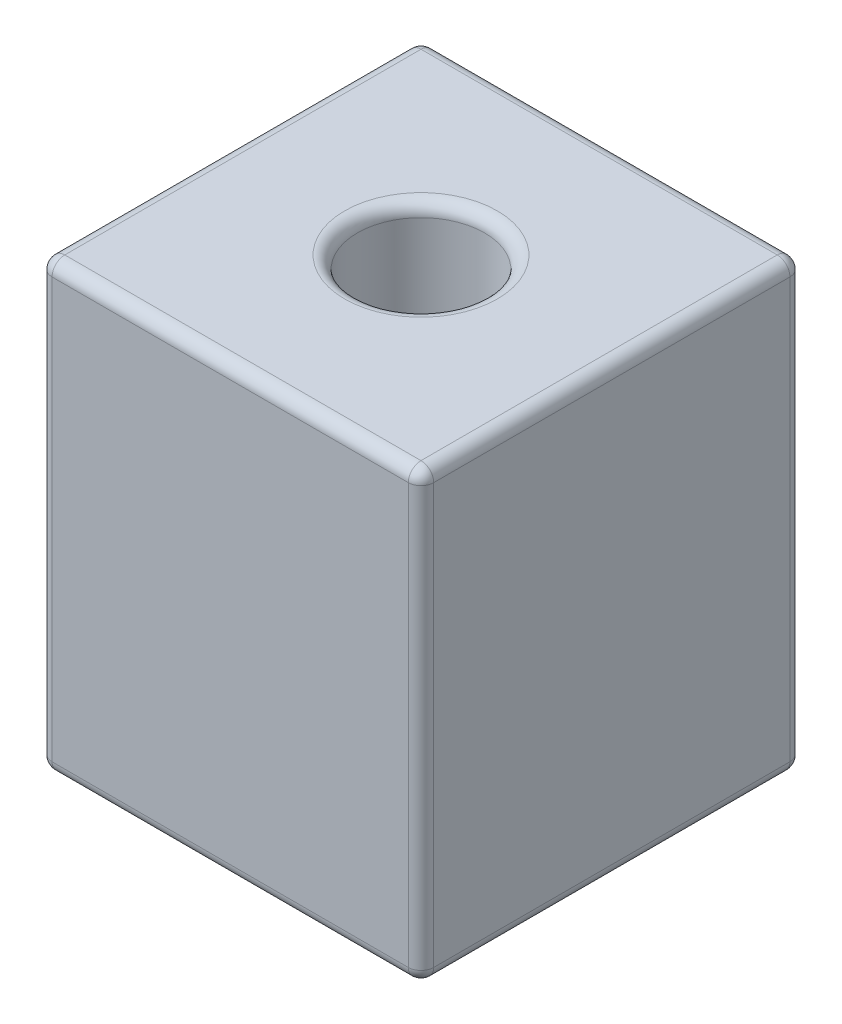
ISO-10303-21;
HEADER;
FILE_DESCRIPTION(('STEP AP214'),'2;1');
FILE_NAME('part.step','',(''),(''),'','','');
FILE_SCHEMA(('AUTOMOTIVE_DESIGN { 1 0 10303 214 1 1 1 1 }'));
ENDSEC;
DATA;
#1=APPLICATION_CONTEXT('core data for automotive mechanical design processes');
#2=APPLICATION_PROTOCOL_DEFINITION('international standard','automotive_design',2000,#1);
#3=PRODUCT_CONTEXT('',#1,'mechanical');
#4=PRODUCT('Part','Part','',(#3));
#5=PRODUCT_RELATED_PRODUCT_CATEGORY('part','',(#4));
#6=PRODUCT_DEFINITION_FORMATION('','',#4);
#7=PRODUCT_DEFINITION_CONTEXT('part definition',#1,'design');
#8=PRODUCT_DEFINITION('design','',#6,#7);
#9=PRODUCT_DEFINITION_SHAPE('','',#8);
#10=(LENGTH_UNIT() NAMED_UNIT(*) SI_UNIT(.MILLI.,.METRE.));
#11=(NAMED_UNIT(*) PLANE_ANGLE_UNIT() SI_UNIT($,.RADIAN.));
#12=(NAMED_UNIT(*) SI_UNIT($,.STERADIAN.) SOLID_ANGLE_UNIT());
#13=UNCERTAINTY_MEASURE_WITH_UNIT(LENGTH_MEASURE(1.E-05),#10,'distance_accuracy_value','');
#14=(GEOMETRIC_REPRESENTATION_CONTEXT(3) GLOBAL_UNCERTAINTY_ASSIGNED_CONTEXT((#13)) GLOBAL_UNIT_ASSIGNED_CONTEXT((#10,
#11,#12)) REPRESENTATION_CONTEXT('',''));
#15=CARTESIAN_POINT('',(0.,0.,0.));
#16=DIRECTION('',(0.,0.,1.));
#17=DIRECTION('',(1.,0.,0.));
#18=AXIS2_PLACEMENT_3D('',#15,#16,#17);
#19=CARTESIAN_POINT('',(15.,-17.5,30.));
#20=DIRECTION('',(-1.,0.,0.));
#21=DIRECTION('',(0.,0.,1.));
#22=AXIS2_PLACEMENT_3D('',#19,#20,#21);
#23=PLANE('',#22);
#24=DIRECTION('',(0.,1.,0.));
#25=VECTOR('',#24,1.);
#26=CARTESIAN_POINT('',(15.,-17.5,29.));
#27=LINE('',#26,#25);
#28=CARTESIAN_POINT('',(15.,16.5,29.));
#29=VERTEX_POINT('',#28);
#30=CARTESIAN_POINT('',(15.,-16.5,29.));
#31=VERTEX_POINT('',#30);
#32=EDGE_CURVE('E189',#29,#31,#27,.F.);
#33=ORIENTED_EDGE('',*,*,#32,.T.);
#34=DIRECTION('',(0.,0.,-1.));
#35=VECTOR('',#34,1.);
#36=CARTESIAN_POINT('',(15.,-16.5,30.));
#37=LINE('',#36,#35);
#38=CARTESIAN_POINT('',(15.,-16.5,1.));
#39=VERTEX_POINT('',#38);
#40=EDGE_CURVE('E191',#31,#39,#37,.T.);
#41=ORIENTED_EDGE('',*,*,#40,.T.);
#42=DIRECTION('',(0.,1.,0.));
#43=VECTOR('',#42,1.);
#44=CARTESIAN_POINT('',(15.,17.5,1.));
#45=LINE('',#44,#43);
#46=CARTESIAN_POINT('',(15.,16.5,1.));
#47=VERTEX_POINT('',#46);
#48=EDGE_CURVE('E185',#39,#47,#45,.T.);
#49=ORIENTED_EDGE('',*,*,#48,.T.);
#50=DIRECTION('',(0.,0.,-1.));
#51=VECTOR('',#50,1.);
#52=CARTESIAN_POINT('',(15.,16.5,30.));
#53=LINE('',#52,#51);
#54=EDGE_CURVE('E187',#47,#29,#53,.F.);
#55=ORIENTED_EDGE('',*,*,#54,.T.);
#56=EDGE_LOOP('',(#33,#41,#49,#55));
#57=FACE_BOUND('',#56,.T.);
#58=ADVANCED_FACE('F33',(#57),#23,.F.);
#59=CARTESIAN_POINT('',(-15.,17.5,30.));
#60=DIRECTION('',(0.,-1.,0.));
#61=DIRECTION('',(0.,0.,-1.));
#62=AXIS2_PLACEMENT_3D('',#59,#60,#61);
#63=PLANE('',#62);
#64=DIRECTION('',(0.,0.,-1.));
#65=VECTOR('',#64,1.);
#66=CARTESIAN_POINT('',(-14.,17.5,30.));
#67=LINE('',#66,#65);
#68=CARTESIAN_POINT('',(-14.,17.5,1.));
#69=VERTEX_POINT('',#68);
#70=CARTESIAN_POINT('',(-14.,17.5,29.));
#71=VERTEX_POINT('',#70);
#72=EDGE_CURVE('E178',#69,#71,#67,.F.);
#73=ORIENTED_EDGE('',*,*,#72,.T.);
#74=DIRECTION('',(-1.,0.,0.));
#75=VECTOR('',#74,1.);
#76=CARTESIAN_POINT('',(-15.,17.5,29.));
#77=LINE('',#76,#75);
#78=CARTESIAN_POINT('',(14.,17.5,29.));
#79=VERTEX_POINT('',#78);
#80=EDGE_CURVE('E142',#71,#79,#77,.F.);
#81=ORIENTED_EDGE('',*,*,#80,.T.);
#82=DIRECTION('',(0.,0.,-1.));
#83=VECTOR('',#82,1.);
#84=CARTESIAN_POINT('',(14.,17.5,30.));
#85=LINE('',#84,#83);
#86=CARTESIAN_POINT('',(14.,17.5,1.));
#87=VERTEX_POINT('',#86);
#88=EDGE_CURVE('E182',#79,#87,#85,.T.);
#89=ORIENTED_EDGE('',*,*,#88,.T.);
#90=DIRECTION('',(-1.,0.,0.));
#91=VECTOR('',#90,1.);
#92=CARTESIAN_POINT('',(-15.,17.5,1.));
#93=LINE('',#92,#91);
#94=EDGE_CURVE('E180',#87,#69,#93,.T.);
#95=ORIENTED_EDGE('',*,*,#94,.T.);
#96=EDGE_LOOP('',(#73,#81,#89,#95));
#97=FACE_BOUND('',#96,.T.);
#98=CARTESIAN_POINT('',(0.,17.5,15.));
#99=DIRECTION('',(0.,-1.,0.));
#100=DIRECTION('',(0.,0.,-1.));
#101=AXIS2_PLACEMENT_3D('',#98,#99,#100);
#102=CIRCLE('',#101,6.);
#103=CARTESIAN_POINT('',(0.,17.5,9.));
#104=VERTEX_POINT('',#103);
#105=EDGE_CURVE('E175',#104,#104,#102,.T.);
#106=ORIENTED_EDGE('',*,*,#105,.T.);
#107=EDGE_LOOP('',(#106));
#108=FACE_BOUND('',#107,.T.);
#109=ADVANCED_FACE('F309',(#97,#108),#63,.F.);
#110=CARTESIAN_POINT('',(-15.,-17.5,30.));
#111=DIRECTION('',(1.,0.,0.));
#112=DIRECTION('',(0.,0.,-1.));
#113=AXIS2_PLACEMENT_3D('',#110,#111,#112);
#114=PLANE('',#113);
#115=DIRECTION('',(0.,-1.,0.));
#116=VECTOR('',#115,1.);
#117=CARTESIAN_POINT('',(-15.,-17.5,29.));
#118=LINE('',#117,#116);
#119=CARTESIAN_POINT('',(-15.,-16.5,29.));
#120=VERTEX_POINT('',#119);
#121=CARTESIAN_POINT('',(-15.,16.5,29.));
#122=VERTEX_POINT('',#121);
#123=EDGE_CURVE('E50',#120,#122,#118,.F.);
#124=ORIENTED_EDGE('',*,*,#123,.T.);
#125=DIRECTION('',(0.,0.,-1.));
#126=VECTOR('',#125,1.);
#127=CARTESIAN_POINT('',(-15.,16.5,30.));
#128=LINE('',#127,#126);
#129=CARTESIAN_POINT('',(-15.,16.5,1.));
#130=VERTEX_POINT('',#129);
#131=EDGE_CURVE('E207',#122,#130,#128,.T.);
#132=ORIENTED_EDGE('',*,*,#131,.T.);
#133=DIRECTION('',(0.,-1.,0.));
#134=VECTOR('',#133,1.);
#135=CARTESIAN_POINT('',(-15.,-17.5,1.));
#136=LINE('',#135,#134);
#137=CARTESIAN_POINT('',(-15.,-16.5,1.));
#138=VERTEX_POINT('',#137);
#139=EDGE_CURVE('E203',#130,#138,#136,.T.);
#140=ORIENTED_EDGE('',*,*,#139,.T.);
#141=DIRECTION('',(0.,0.,-1.));
#142=VECTOR('',#141,1.);
#143=CARTESIAN_POINT('',(-15.,-16.5,30.));
#144=LINE('',#143,#142);
#145=EDGE_CURVE('E55',#138,#120,#144,.F.);
#146=ORIENTED_EDGE('',*,*,#145,.T.);
#147=EDGE_LOOP('',(#124,#132,#140,#146));
#148=FACE_BOUND('',#147,.T.);
#149=ADVANCED_FACE('F312',(#148),#114,.F.);
#150=CARTESIAN_POINT('',(-15.,-17.5,30.));
#151=DIRECTION('',(0.,1.,0.));
#152=DIRECTION('',(0.,0.,1.));
#153=AXIS2_PLACEMENT_3D('',#150,#151,#152);
#154=PLANE('',#153);
#155=DIRECTION('',(0.,0.,-1.));
#156=VECTOR('',#155,1.);
#157=CARTESIAN_POINT('',(14.,-17.5,30.));
#158=LINE('',#157,#156);
#159=CARTESIAN_POINT('',(14.,-17.5,1.));
#160=VERTEX_POINT('',#159);
#161=CARTESIAN_POINT('',(14.,-17.5,29.));
#162=VERTEX_POINT('',#161);
#163=EDGE_CURVE('E170',#160,#162,#158,.F.);
#164=ORIENTED_EDGE('',*,*,#163,.T.);
#165=DIRECTION('',(1.,0.,0.));
#166=VECTOR('',#165,1.);
#167=CARTESIAN_POINT('',(-15.,-17.5,29.));
#168=LINE('',#167,#166);
#169=CARTESIAN_POINT('',(-14.,-17.5,29.));
#170=VERTEX_POINT('',#169);
#171=EDGE_CURVE('E172',#162,#170,#168,.F.);
#172=ORIENTED_EDGE('',*,*,#171,.T.);
#173=DIRECTION('',(0.,0.,-1.));
#174=VECTOR('',#173,1.);
#175=CARTESIAN_POINT('',(-14.,-17.5,30.));
#176=LINE('',#175,#174);
#177=CARTESIAN_POINT('',(-14.,-17.5,1.));
#178=VERTEX_POINT('',#177);
#179=EDGE_CURVE('E166',#170,#178,#176,.T.);
#180=ORIENTED_EDGE('',*,*,#179,.T.);
#181=DIRECTION('',(1.,0.,0.));
#182=VECTOR('',#181,1.);
#183=CARTESIAN_POINT('',(15.,-17.5,1.));
#184=LINE('',#183,#182);
#185=EDGE_CURVE('E168',#178,#160,#184,.T.);
#186=ORIENTED_EDGE('',*,*,#185,.T.);
#187=EDGE_LOOP('',(#164,#172,#180,#186));
#188=FACE_BOUND('',#187,.T.);
#189=ADVANCED_FACE('F551',(#188),#154,.F.);
#190=CARTESIAN_POINT('',(0.,0.,30.));
#191=DIRECTION('',(0.,0.,-1.));
#192=DIRECTION('',(-1.,0.,0.));
#193=AXIS2_PLACEMENT_3D('',#190,#191,#192);
#194=PLANE('',#193);
#195=DIRECTION('',(1.,0.,0.));
#196=VECTOR('',#195,1.);
#197=CARTESIAN_POINT('',(0.,-16.5,30.));
#198=LINE('',#197,#196);
#199=CARTESIAN_POINT('',(-14.,-16.5,30.));
#200=VERTEX_POINT('',#199);
#201=CARTESIAN_POINT('',(14.,-16.5,30.));
#202=VERTEX_POINT('',#201);
#203=EDGE_CURVE('E134',#200,#202,#198,.T.);
#204=ORIENTED_EDGE('',*,*,#203,.T.);
#205=DIRECTION('',(0.,1.,0.));
#206=VECTOR('',#205,1.);
#207=CARTESIAN_POINT('',(14.,0.,30.));
#208=LINE('',#207,#206);
#209=CARTESIAN_POINT('',(14.,16.5,30.));
#210=VERTEX_POINT('',#209);
#211=EDGE_CURVE('E130',#202,#210,#208,.T.);
#212=ORIENTED_EDGE('',*,*,#211,.T.);
#213=DIRECTION('',(-1.,0.,0.));
#214=VECTOR('',#213,1.);
#215=CARTESIAN_POINT('',(0.,16.5,30.));
#216=LINE('',#215,#214);
#217=CARTESIAN_POINT('',(-14.,16.5,30.));
#218=VERTEX_POINT('',#217);
#219=EDGE_CURVE('E122',#210,#218,#216,.T.);
#220=ORIENTED_EDGE('',*,*,#219,.T.);
#221=DIRECTION('',(0.,-1.,0.));
#222=VECTOR('',#221,1.);
#223=CARTESIAN_POINT('',(-14.,0.,30.));
#224=LINE('',#223,#222);
#225=EDGE_CURVE('E127',#218,#200,#224,.T.);
#226=ORIENTED_EDGE('',*,*,#225,.T.);
#227=EDGE_LOOP('',(#204,#212,#220,#226));
#228=FACE_BOUND('',#227,.T.);
#229=ADVANCED_FACE('F125',(#228),#194,.F.);
#230=CARTESIAN_POINT('',(0.,0.,0.));
#231=DIRECTION('',(0.,0.,-1.));
#232=DIRECTION('',(-1.,0.,0.));
#233=AXIS2_PLACEMENT_3D('',#230,#231,#232);
#234=PLANE('',#233);
#235=DIRECTION('',(-1.,0.,0.));
#236=VECTOR('',#235,1.);
#237=CARTESIAN_POINT('',(15.,16.5,0.));
#238=LINE('',#237,#236);
#239=CARTESIAN_POINT('',(-14.,16.5,0.));
#240=VERTEX_POINT('',#239);
#241=CARTESIAN_POINT('',(14.,16.5,0.));
#242=VERTEX_POINT('',#241);
#243=EDGE_CURVE('E198',#240,#242,#238,.F.);
#244=ORIENTED_EDGE('',*,*,#243,.T.);
#245=DIRECTION('',(0.,1.,0.));
#246=VECTOR('',#245,1.);
#247=CARTESIAN_POINT('',(14.,-17.5,0.));
#248=LINE('',#247,#246);
#249=CARTESIAN_POINT('',(14.,-16.5,0.));
#250=VERTEX_POINT('',#249);
#251=EDGE_CURVE('E201',#242,#250,#248,.F.);
#252=ORIENTED_EDGE('',*,*,#251,.T.);
#253=DIRECTION('',(1.,0.,0.));
#254=VECTOR('',#253,1.);
#255=CARTESIAN_POINT('',(-15.,-16.5,0.));
#256=LINE('',#255,#254);
#257=CARTESIAN_POINT('',(-14.,-16.5,0.));
#258=VERTEX_POINT('',#257);
#259=EDGE_CURVE('E196',#250,#258,#256,.F.);
#260=ORIENTED_EDGE('',*,*,#259,.T.);
#261=DIRECTION('',(0.,-1.,0.));
#262=VECTOR('',#261,1.);
#263=CARTESIAN_POINT('',(-14.,17.5,0.));
#264=LINE('',#263,#262);
#265=EDGE_CURVE('E194',#258,#240,#264,.F.);
#266=ORIENTED_EDGE('',*,*,#265,.T.);
#267=EDGE_LOOP('',(#244,#252,#260,#266));
#268=FACE_BOUND('',#267,.T.);
#269=ADVANCED_FACE('F285',(#268),#234,.T.);
#270=CARTESIAN_POINT('',(0.,-12.5,15.));
#271=DIRECTION('',(0.,1.,0.));
#272=DIRECTION('',(0.,0.,1.));
#273=AXIS2_PLACEMENT_3D('',#270,#271,#272);
#274=CYLINDRICAL_SURFACE('',#273,5.);
#275=CARTESIAN_POINT('',(0.,16.5,15.));
#276=DIRECTION('',(0.,-1.,0.));
#277=DIRECTION('',(0.,0.,-1.));
#278=AXIS2_PLACEMENT_3D('',#275,#276,#277);
#279=CIRCLE('',#278,5.);
#280=CARTESIAN_POINT('',(0.,16.5,10.));
#281=VERTEX_POINT('',#280);
#282=EDGE_CURVE('E42',#281,#281,#279,.F.);
#283=ORIENTED_EDGE('',*,*,#282,.T.);
#284=EDGE_LOOP('',(#283));
#285=FACE_BOUND('',#284,.T.);
#286=CARTESIAN_POINT('',(0.,-11.5,15.));
#287=DIRECTION('',(0.,1.,0.));
#288=DIRECTION('',(0.,0.,1.));
#289=AXIS2_PLACEMENT_3D('',#286,#287,#288);
#290=CIRCLE('',#289,5.);
#291=CARTESIAN_POINT('',(0.,-11.5,20.));
#292=VERTEX_POINT('',#291);
#293=EDGE_CURVE('E209',#292,#292,#290,.F.);
#294=ORIENTED_EDGE('',*,*,#293,.T.);
#295=EDGE_LOOP('',(#294));
#296=FACE_BOUND('',#295,.T.);
#297=ADVANCED_FACE('F322',(#285,#296),#274,.F.);
#298=CARTESIAN_POINT('',(0.,-12.5,15.));
#299=DIRECTION('',(0.,1.,0.));
#300=DIRECTION('',(0.,0.,1.));
#301=AXIS2_PLACEMENT_3D('',#298,#299,#300);
#302=PLANE('',#301);
#303=CARTESIAN_POINT('',(0.,-12.5,15.));
#304=DIRECTION('',(0.,1.,0.));
#305=DIRECTION('',(0.,0.,1.));
#306=AXIS2_PLACEMENT_3D('',#303,#304,#305);
#307=CIRCLE('',#306,4.);
#308=CARTESIAN_POINT('',(0.,-12.5,19.));
#309=VERTEX_POINT('',#308);
#310=EDGE_CURVE('E11',#309,#309,#307,.T.);
#311=ORIENTED_EDGE('',*,*,#310,.T.);
#312=EDGE_LOOP('',(#311));
#313=FACE_BOUND('',#312,.T.);
#314=ADVANCED_FACE('F325',(#313),#302,.T.);
#315=CARTESIAN_POINT('',(-15.,16.5,1.));
#316=DIRECTION('',(1.,0.,0.));
#317=DIRECTION('',(0.,0.,-1.));
#318=AXIS2_PLACEMENT_3D('',#315,#316,#317);
#319=CYLINDRICAL_SURFACE('',#318,1.);
#320=CARTESIAN_POINT('',(-14.,16.5,1.));
#321=DIRECTION('',(-1.,0.,0.));
#322=DIRECTION('',(0.,0.,1.));
#323=AXIS2_PLACEMENT_3D('',#320,#321,#322);
#324=CIRCLE('',#323,1.);
#325=EDGE_CURVE('E37',#69,#240,#324,.T.);
#326=ORIENTED_EDGE('',*,*,#325,.F.);
#327=ORIENTED_EDGE('',*,*,#94,.F.);
#328=CARTESIAN_POINT('',(14.,16.5,1.));
#329=DIRECTION('',(1.,0.,0.));
#330=DIRECTION('',(0.,0.,-1.));
#331=AXIS2_PLACEMENT_3D('',#328,#329,#330);
#332=CIRCLE('',#331,1.);
#333=EDGE_CURVE('E162',#242,#87,#332,.T.);
#334=ORIENTED_EDGE('',*,*,#333,.F.);
#335=ORIENTED_EDGE('',*,*,#243,.F.);
#336=EDGE_LOOP('',(#326,#327,#334,#335));
#337=FACE_BOUND('',#336,.T.);
#338=ADVANCED_FACE('F301',(#337),#319,.T.);
#339=CARTESIAN_POINT('',(-14.,16.5,1.));
#340=DIRECTION('',(0.,0.,1.));
#341=DIRECTION('',(1.,0.,0.));
#342=AXIS2_PLACEMENT_3D('',#339,#340,#341);
#343=SPHERICAL_SURFACE('',#342,1.);
#344=CARTESIAN_POINT('',(-14.,16.5,1.));
#345=DIRECTION('',(0.,0.,-1.));
#346=DIRECTION('',(-1.,0.,0.));
#347=AXIS2_PLACEMENT_3D('',#344,#345,#346);
#348=CIRCLE('',#347,1.);
#349=EDGE_CURVE('E256',#69,#130,#348,.F.);
#350=ORIENTED_EDGE('',*,*,#349,.F.);
#351=ORIENTED_EDGE('',*,*,#325,.T.);
#352=CARTESIAN_POINT('',(-14.,16.5,1.));
#353=DIRECTION('',(0.,1.,0.));
#354=DIRECTION('',(0.,0.,1.));
#355=AXIS2_PLACEMENT_3D('',#352,#353,#354);
#356=CIRCLE('',#355,1.);
#357=EDGE_CURVE('E259',#130,#240,#356,.F.);
#358=ORIENTED_EDGE('',*,*,#357,.F.);
#359=EDGE_LOOP('',(#350,#351,#358));
#360=FACE_BOUND('',#359,.T.);
#361=ADVANCED_FACE('F304',(#360),#343,.T.);
#362=CARTESIAN_POINT('',(14.,16.5,1.));
#363=DIRECTION('',(0.,0.,1.));
#364=DIRECTION('',(1.,0.,0.));
#365=AXIS2_PLACEMENT_3D('',#362,#363,#364);
#366=SPHERICAL_SURFACE('',#365,1.);
#367=CARTESIAN_POINT('',(14.,16.5,1.));
#368=DIRECTION('',(0.,1.,0.));
#369=DIRECTION('',(0.,0.,1.));
#370=AXIS2_PLACEMENT_3D('',#367,#368,#369);
#371=CIRCLE('',#370,1.);
#372=EDGE_CURVE('E250',#242,#47,#371,.F.);
#373=ORIENTED_EDGE('',*,*,#372,.F.);
#374=ORIENTED_EDGE('',*,*,#333,.T.);
#375=CARTESIAN_POINT('',(14.,16.5,1.));
#376=DIRECTION('',(0.,0.,-1.));
#377=DIRECTION('',(-1.,0.,0.));
#378=AXIS2_PLACEMENT_3D('',#375,#376,#377);
#379=CIRCLE('',#378,1.);
#380=EDGE_CURVE('E253',#47,#87,#379,.F.);
#381=ORIENTED_EDGE('',*,*,#380,.F.);
#382=EDGE_LOOP('',(#373,#374,#381));
#383=FACE_BOUND('',#382,.T.);
#384=ADVANCED_FACE('F266',(#383),#366,.T.);
#385=CARTESIAN_POINT('',(-14.,-17.5,1.));
#386=DIRECTION('',(0.,1.,0.));
#387=DIRECTION('',(0.,0.,1.));
#388=AXIS2_PLACEMENT_3D('',#385,#386,#387);
#389=CYLINDRICAL_SURFACE('',#388,1.);
#390=ORIENTED_EDGE('',*,*,#357,.T.);
#391=ORIENTED_EDGE('',*,*,#265,.F.);
#392=CARTESIAN_POINT('',(-14.,-16.5,1.));
#393=DIRECTION('',(0.,-1.,0.));
#394=DIRECTION('',(0.,0.,-1.));
#395=AXIS2_PLACEMENT_3D('',#392,#393,#394);
#396=CIRCLE('',#395,1.);
#397=EDGE_CURVE('E244',#138,#258,#396,.T.);
#398=ORIENTED_EDGE('',*,*,#397,.F.);
#399=ORIENTED_EDGE('',*,*,#139,.F.);
#400=EDGE_LOOP('',(#390,#391,#398,#399));
#401=FACE_BOUND('',#400,.T.);
#402=ADVANCED_FACE('F298',(#401),#389,.T.);
#403=CARTESIAN_POINT('',(-14.,16.5,30.));
#404=DIRECTION('',(0.,0.,-1.));
#405=DIRECTION('',(-1.,0.,0.));
#406=AXIS2_PLACEMENT_3D('',#403,#404,#405);
#407=CYLINDRICAL_SURFACE('',#406,1.);
#408=ORIENTED_EDGE('',*,*,#349,.T.);
#409=ORIENTED_EDGE('',*,*,#131,.F.);
#410=CARTESIAN_POINT('',(-14.,16.5,29.));
#411=DIRECTION('',(0.,0.,1.));
#412=DIRECTION('',(1.,0.,0.));
#413=AXIS2_PLACEMENT_3D('',#410,#411,#412);
#414=CIRCLE('',#413,1.);
#415=EDGE_CURVE('E146',#71,#122,#414,.T.);
#416=ORIENTED_EDGE('',*,*,#415,.F.);
#417=ORIENTED_EDGE('',*,*,#72,.F.);
#418=EDGE_LOOP('',(#408,#409,#416,#417));
#419=FACE_BOUND('',#418,.T.);
#420=ADVANCED_FACE('F307',(#419),#407,.T.);
#421=CARTESIAN_POINT('',(0.,16.5,29.));
#422=DIRECTION('',(-1.,0.,0.));
#423=DIRECTION('',(0.,0.,1.));
#424=AXIS2_PLACEMENT_3D('',#421,#422,#423);
#425=CYLINDRICAL_SURFACE('',#424,1.);
#426=CARTESIAN_POINT('',(14.,16.5,29.));
#427=DIRECTION('',(1.,0.,0.));
#428=DIRECTION('',(0.,0.,-1.));
#429=AXIS2_PLACEMENT_3D('',#426,#427,#428);
#430=CIRCLE('',#429,1.);
#431=EDGE_CURVE('E147',#79,#210,#430,.T.);
#432=ORIENTED_EDGE('',*,*,#431,.F.);
#433=ORIENTED_EDGE('',*,*,#80,.F.);
#434=CARTESIAN_POINT('',(-14.,16.5,29.));
#435=DIRECTION('',(-1.,0.,0.));
#436=DIRECTION('',(0.,0.,1.));
#437=AXIS2_PLACEMENT_3D('',#434,#435,#436);
#438=CIRCLE('',#437,1.);
#439=EDGE_CURVE('E138',#218,#71,#438,.T.);
#440=ORIENTED_EDGE('',*,*,#439,.F.);
#441=ORIENTED_EDGE('',*,*,#219,.F.);
#442=EDGE_LOOP('',(#432,#433,#440,#441));
#443=FACE_BOUND('',#442,.T.);
#444=ADVANCED_FACE('F140',(#443),#425,.T.);
#445=CARTESIAN_POINT('',(14.,16.5,30.));
#446=DIRECTION('',(0.,0.,-1.));
#447=DIRECTION('',(-1.,0.,0.));
#448=AXIS2_PLACEMENT_3D('',#445,#446,#447);
#449=CYLINDRICAL_SURFACE('',#448,1.);
#450=ORIENTED_EDGE('',*,*,#380,.T.);
#451=ORIENTED_EDGE('',*,*,#88,.F.);
#452=CARTESIAN_POINT('',(14.,16.5,29.));
#453=DIRECTION('',(0.,0.,1.));
#454=DIRECTION('',(1.,0.,0.));
#455=AXIS2_PLACEMENT_3D('',#452,#453,#454);
#456=CIRCLE('',#455,1.);
#457=EDGE_CURVE('E240',#29,#79,#456,.T.);
#458=ORIENTED_EDGE('',*,*,#457,.F.);
#459=ORIENTED_EDGE('',*,*,#54,.F.);
#460=EDGE_LOOP('',(#450,#451,#458,#459));
#461=FACE_BOUND('',#460,.T.);
#462=ADVANCED_FACE('F273',(#461),#449,.T.);
#463=CARTESIAN_POINT('',(14.,-17.5,1.));
#464=DIRECTION('',(0.,-1.,0.));
#465=DIRECTION('',(0.,0.,-1.));
#466=AXIS2_PLACEMENT_3D('',#463,#464,#465);
#467=CYLINDRICAL_SURFACE('',#466,1.);
#468=ORIENTED_EDGE('',*,*,#372,.T.);
#469=ORIENTED_EDGE('',*,*,#48,.F.);
#470=CARTESIAN_POINT('',(14.,-16.5,1.));
#471=DIRECTION('',(0.,-1.,0.));
#472=DIRECTION('',(0.,0.,-1.));
#473=AXIS2_PLACEMENT_3D('',#470,#471,#472);
#474=CIRCLE('',#473,1.);
#475=EDGE_CURVE('E237',#250,#39,#474,.T.);
#476=ORIENTED_EDGE('',*,*,#475,.F.);
#477=ORIENTED_EDGE('',*,*,#251,.F.);
#478=EDGE_LOOP('',(#468,#469,#476,#477));
#479=FACE_BOUND('',#478,.T.);
#480=ADVANCED_FACE('F282',(#479),#467,.T.);
#481=CARTESIAN_POINT('',(-15.,-16.5,1.));
#482=DIRECTION('',(-1.,0.,0.));
#483=DIRECTION('',(0.,0.,1.));
#484=AXIS2_PLACEMENT_3D('',#481,#482,#483);
#485=CYLINDRICAL_SURFACE('',#484,1.);
#486=CARTESIAN_POINT('',(-14.,-16.5,1.));
#487=DIRECTION('',(-1.,0.,0.));
#488=DIRECTION('',(0.,0.,1.));
#489=AXIS2_PLACEMENT_3D('',#486,#487,#488);
#490=CIRCLE('',#489,1.);
#491=EDGE_CURVE('E247',#258,#178,#490,.T.);
#492=ORIENTED_EDGE('',*,*,#491,.F.);
#493=ORIENTED_EDGE('',*,*,#259,.F.);
#494=CARTESIAN_POINT('',(14.,-16.5,1.));
#495=DIRECTION('',(1.,0.,0.));
#496=DIRECTION('',(0.,0.,-1.));
#497=AXIS2_PLACEMENT_3D('',#494,#495,#496);
#498=CIRCLE('',#497,1.);
#499=EDGE_CURVE('E234',#160,#250,#498,.T.);
#500=ORIENTED_EDGE('',*,*,#499,.F.);
#501=ORIENTED_EDGE('',*,*,#185,.F.);
#502=EDGE_LOOP('',(#492,#493,#500,#501));
#503=FACE_BOUND('',#502,.T.);
#504=ADVANCED_FACE('F290',(#503),#485,.T.);
#505=CARTESIAN_POINT('',(-14.,-16.5,1.));
#506=DIRECTION('',(0.,0.,1.));
#507=DIRECTION('',(1.,0.,0.));
#508=AXIS2_PLACEMENT_3D('',#505,#506,#507);
#509=SPHERICAL_SURFACE('',#508,1.);
#510=ORIENTED_EDGE('',*,*,#397,.T.);
#511=ORIENTED_EDGE('',*,*,#491,.T.);
#512=CARTESIAN_POINT('',(-14.,-16.5,1.));
#513=DIRECTION('',(0.,0.,-1.));
#514=DIRECTION('',(-1.,0.,0.));
#515=AXIS2_PLACEMENT_3D('',#512,#513,#514);
#516=CIRCLE('',#515,1.);
#517=EDGE_CURVE('E153',#138,#178,#516,.F.);
#518=ORIENTED_EDGE('',*,*,#517,.F.);
#519=EDGE_LOOP('',(#510,#511,#518));
#520=FACE_BOUND('',#519,.T.);
#521=ADVANCED_FACE('F296',(#520),#509,.T.);
#522=CARTESIAN_POINT('',(-14.,16.5,29.));
#523=DIRECTION('',(0.,0.,1.));
#524=DIRECTION('',(1.,0.,0.));
#525=AXIS2_PLACEMENT_3D('',#522,#523,#524);
#526=SPHERICAL_SURFACE('',#525,1.);
#527=ORIENTED_EDGE('',*,*,#439,.T.);
#528=ORIENTED_EDGE('',*,*,#415,.T.);
#529=CARTESIAN_POINT('',(-14.,16.5,29.));
#530=DIRECTION('',(0.,1.,0.));
#531=DIRECTION('',(0.,0.,1.));
#532=AXIS2_PLACEMENT_3D('',#529,#530,#531);
#533=CIRCLE('',#532,1.);
#534=EDGE_CURVE('E150',#218,#122,#533,.F.);
#535=ORIENTED_EDGE('',*,*,#534,.F.);
#536=EDGE_LOOP('',(#527,#528,#535));
#537=FACE_BOUND('',#536,.T.);
#538=ADVANCED_FACE('F151',(#537),#526,.T.);
#539=CARTESIAN_POINT('',(14.,16.5,29.));
#540=DIRECTION('',(0.,0.,1.));
#541=DIRECTION('',(1.,0.,0.));
#542=AXIS2_PLACEMENT_3D('',#539,#540,#541);
#543=SPHERICAL_SURFACE('',#542,1.);
#544=ORIENTED_EDGE('',*,*,#457,.T.);
#545=ORIENTED_EDGE('',*,*,#431,.T.);
#546=CARTESIAN_POINT('',(14.,16.5,29.));
#547=DIRECTION('',(0.,1.,0.));
#548=DIRECTION('',(0.,0.,1.));
#549=AXIS2_PLACEMENT_3D('',#546,#547,#548);
#550=CIRCLE('',#549,1.);
#551=EDGE_CURVE('E154',#29,#210,#550,.F.);
#552=ORIENTED_EDGE('',*,*,#551,.F.);
#553=EDGE_LOOP('',(#544,#545,#552));
#554=FACE_BOUND('',#553,.T.);
#555=ADVANCED_FACE('F373',(#554),#543,.T.);
#556=CARTESIAN_POINT('',(14.,-16.5,1.));
#557=DIRECTION('',(0.,0.,1.));
#558=DIRECTION('',(1.,0.,0.));
#559=AXIS2_PLACEMENT_3D('',#556,#557,#558);
#560=SPHERICAL_SURFACE('',#559,1.);
#561=ORIENTED_EDGE('',*,*,#499,.T.);
#562=ORIENTED_EDGE('',*,*,#475,.T.);
#563=CARTESIAN_POINT('',(14.,-16.5,1.));
#564=DIRECTION('',(0.,0.,-1.));
#565=DIRECTION('',(-1.,0.,0.));
#566=AXIS2_PLACEMENT_3D('',#563,#564,#565);
#567=CIRCLE('',#566,1.);
#568=EDGE_CURVE('E228',#160,#39,#567,.F.);
#569=ORIENTED_EDGE('',*,*,#568,.F.);
#570=EDGE_LOOP('',(#561,#562,#569));
#571=FACE_BOUND('',#570,.T.);
#572=ADVANCED_FACE('F369',(#571),#560,.T.);
#573=CARTESIAN_POINT('',(-14.,-16.5,30.));
#574=DIRECTION('',(0.,0.,-1.));
#575=DIRECTION('',(-1.,0.,0.));
#576=AXIS2_PLACEMENT_3D('',#573,#574,#575);
#577=CYLINDRICAL_SURFACE('',#576,1.);
#578=ORIENTED_EDGE('',*,*,#517,.T.);
#579=ORIENTED_EDGE('',*,*,#179,.F.);
#580=CARTESIAN_POINT('',(-14.,-16.5,29.));
#581=DIRECTION('',(0.,0.,1.));
#582=DIRECTION('',(1.,0.,0.));
#583=AXIS2_PLACEMENT_3D('',#580,#581,#582);
#584=CIRCLE('',#583,1.);
#585=EDGE_CURVE('E225',#120,#170,#584,.T.);
#586=ORIENTED_EDGE('',*,*,#585,.F.);
#587=ORIENTED_EDGE('',*,*,#145,.F.);
#588=EDGE_LOOP('',(#578,#579,#586,#587));
#589=FACE_BOUND('',#588,.T.);
#590=ADVANCED_FACE('F366',(#589),#577,.T.);
#591=CARTESIAN_POINT('',(-14.,0.,29.));
#592=DIRECTION('',(0.,-1.,0.));
#593=DIRECTION('',(0.,0.,-1.));
#594=AXIS2_PLACEMENT_3D('',#591,#592,#593);
#595=CYLINDRICAL_SURFACE('',#594,1.);
#596=ORIENTED_EDGE('',*,*,#534,.T.);
#597=ORIENTED_EDGE('',*,*,#123,.F.);
#598=CARTESIAN_POINT('',(-14.,-16.5,29.));
#599=DIRECTION('',(0.,-1.,0.));
#600=DIRECTION('',(0.,0.,-1.));
#601=AXIS2_PLACEMENT_3D('',#598,#599,#600);
#602=CIRCLE('',#601,1.);
#603=EDGE_CURVE('E158',#200,#120,#602,.T.);
#604=ORIENTED_EDGE('',*,*,#603,.F.);
#605=ORIENTED_EDGE('',*,*,#225,.F.);
#606=EDGE_LOOP('',(#596,#597,#604,#605));
#607=FACE_BOUND('',#606,.T.);
#608=ADVANCED_FACE('F156',(#607),#595,.T.);
#609=CARTESIAN_POINT('',(14.,0.,29.));
#610=DIRECTION('',(0.,1.,0.));
#611=DIRECTION('',(0.,0.,1.));
#612=AXIS2_PLACEMENT_3D('',#609,#610,#611);
#613=CYLINDRICAL_SURFACE('',#612,1.);
#614=ORIENTED_EDGE('',*,*,#551,.T.);
#615=ORIENTED_EDGE('',*,*,#211,.F.);
#616=CARTESIAN_POINT('',(14.,-16.5,29.));
#617=DIRECTION('',(0.,-1.,0.));
#618=DIRECTION('',(0.,0.,-1.));
#619=AXIS2_PLACEMENT_3D('',#616,#617,#618);
#620=CIRCLE('',#619,1.);
#621=EDGE_CURVE('E221',#31,#202,#620,.T.);
#622=ORIENTED_EDGE('',*,*,#621,.F.);
#623=ORIENTED_EDGE('',*,*,#32,.F.);
#624=EDGE_LOOP('',(#614,#615,#622,#623));
#625=FACE_BOUND('',#624,.T.);
#626=ADVANCED_FACE('F359',(#625),#613,.T.);
#627=CARTESIAN_POINT('',(14.,-16.5,30.));
#628=DIRECTION('',(0.,0.,-1.));
#629=DIRECTION('',(-1.,0.,0.));
#630=AXIS2_PLACEMENT_3D('',#627,#628,#629);
#631=CYLINDRICAL_SURFACE('',#630,1.);
#632=ORIENTED_EDGE('',*,*,#568,.T.);
#633=ORIENTED_EDGE('',*,*,#40,.F.);
#634=CARTESIAN_POINT('',(14.,-16.5,29.));
#635=DIRECTION('',(0.,0.,1.));
#636=DIRECTION('',(1.,0.,0.));
#637=AXIS2_PLACEMENT_3D('',#634,#635,#636);
#638=CIRCLE('',#637,1.);
#639=EDGE_CURVE('E218',#162,#31,#638,.T.);
#640=ORIENTED_EDGE('',*,*,#639,.F.);
#641=ORIENTED_EDGE('',*,*,#163,.F.);
#642=EDGE_LOOP('',(#632,#633,#640,#641));
#643=FACE_BOUND('',#642,.T.);
#644=ADVANCED_FACE('F355',(#643),#631,.T.);
#645=CARTESIAN_POINT('',(-14.,-16.5,29.));
#646=DIRECTION('',(0.,0.,1.));
#647=DIRECTION('',(1.,0.,0.));
#648=AXIS2_PLACEMENT_3D('',#645,#646,#647);
#649=SPHERICAL_SURFACE('',#648,1.);
#650=ORIENTED_EDGE('',*,*,#603,.T.);
#651=ORIENTED_EDGE('',*,*,#585,.T.);
#652=CARTESIAN_POINT('',(-14.,-16.5,29.));
#653=DIRECTION('',(-1.,0.,0.));
#654=DIRECTION('',(0.,0.,1.));
#655=AXIS2_PLACEMENT_3D('',#652,#653,#654);
#656=CIRCLE('',#655,1.);
#657=EDGE_CURVE('E216',#200,#170,#656,.F.);
#658=ORIENTED_EDGE('',*,*,#657,.F.);
#659=EDGE_LOOP('',(#650,#651,#658));
#660=FACE_BOUND('',#659,.T.);
#661=ADVANCED_FACE('F351',(#660),#649,.T.);
#662=CARTESIAN_POINT('',(14.,-16.5,29.));
#663=DIRECTION('',(0.,0.,1.));
#664=DIRECTION('',(1.,0.,0.));
#665=AXIS2_PLACEMENT_3D('',#662,#663,#664);
#666=SPHERICAL_SURFACE('',#665,1.);
#667=ORIENTED_EDGE('',*,*,#639,.T.);
#668=ORIENTED_EDGE('',*,*,#621,.T.);
#669=CARTESIAN_POINT('',(14.,-16.5,29.));
#670=DIRECTION('',(1.,0.,0.));
#671=DIRECTION('',(0.,0.,-1.));
#672=AXIS2_PLACEMENT_3D('',#669,#670,#671);
#673=CIRCLE('',#672,1.);
#674=EDGE_CURVE('E214',#162,#202,#673,.F.);
#675=ORIENTED_EDGE('',*,*,#674,.F.);
#676=EDGE_LOOP('',(#667,#668,#675));
#677=FACE_BOUND('',#676,.T.);
#678=ADVANCED_FACE('F347',(#677),#666,.T.);
#679=CARTESIAN_POINT('',(0.,-16.5,29.));
#680=DIRECTION('',(1.,0.,0.));
#681=DIRECTION('',(0.,0.,-1.));
#682=AXIS2_PLACEMENT_3D('',#679,#680,#681);
#683=CYLINDRICAL_SURFACE('',#682,1.);
#684=ORIENTED_EDGE('',*,*,#657,.T.);
#685=ORIENTED_EDGE('',*,*,#171,.F.);
#686=ORIENTED_EDGE('',*,*,#674,.T.);
#687=ORIENTED_EDGE('',*,*,#203,.F.);
#688=EDGE_LOOP('',(#684,#685,#686,#687));
#689=FACE_BOUND('',#688,.T.);
#690=ADVANCED_FACE('F319',(#689),#683,.T.);
#691=CARTESIAN_POINT('',(0.,16.5,15.));
#692=DIRECTION('',(0.,-1.,0.));
#693=DIRECTION('',(0.,0.,-1.));
#694=AXIS2_PLACEMENT_3D('',#691,#692,#693);
#695=TOROIDAL_SURFACE('',#694,6.,1.);
#696=ORIENTED_EDGE('',*,*,#105,.F.);
#697=EDGE_LOOP('',(#696));
#698=FACE_BOUND('',#697,.T.);
#699=ORIENTED_EDGE('',*,*,#282,.F.);
#700=EDGE_LOOP('',(#699));
#701=FACE_BOUND('',#700,.T.);
#702=ADVANCED_FACE('F316',(#698,#701),#695,.T.);
#703=CARTESIAN_POINT('',(0.,-11.5,15.));
#704=DIRECTION('',(0.,1.,0.));
#705=DIRECTION('',(0.,0.,1.));
#706=AXIS2_PLACEMENT_3D('',#703,#704,#705);
#707=TOROIDAL_SURFACE('',#706,4.,1.);
#708=ORIENTED_EDGE('',*,*,#293,.F.);
#709=EDGE_LOOP('',(#708));
#710=FACE_BOUND('',#709,.T.);
#711=ORIENTED_EDGE('',*,*,#310,.F.);
#712=EDGE_LOOP('',(#711));
#713=FACE_BOUND('',#712,.T.);
#714=ADVANCED_FACE('F35',(#710,#713),#707,.F.);
#715=CLOSED_SHELL('',(#58,#109,#149,#189,#229,#269,#297,#314,#338,#361,#384,#402,#420,#444,#462,
#480,#504,#521,#538,#555,#572,#590,#608,#626,#644,#661,#678,#690,#702,#714));
#716=MANIFOLD_SOLID_BREP('B2',#715);
#717=ADVANCED_BREP_SHAPE_REPRESENTATION('',(#18,#716),#14);
#718=SHAPE_DEFINITION_REPRESENTATION(#9,#717);
ENDSEC;
END-ISO-10303-21;
